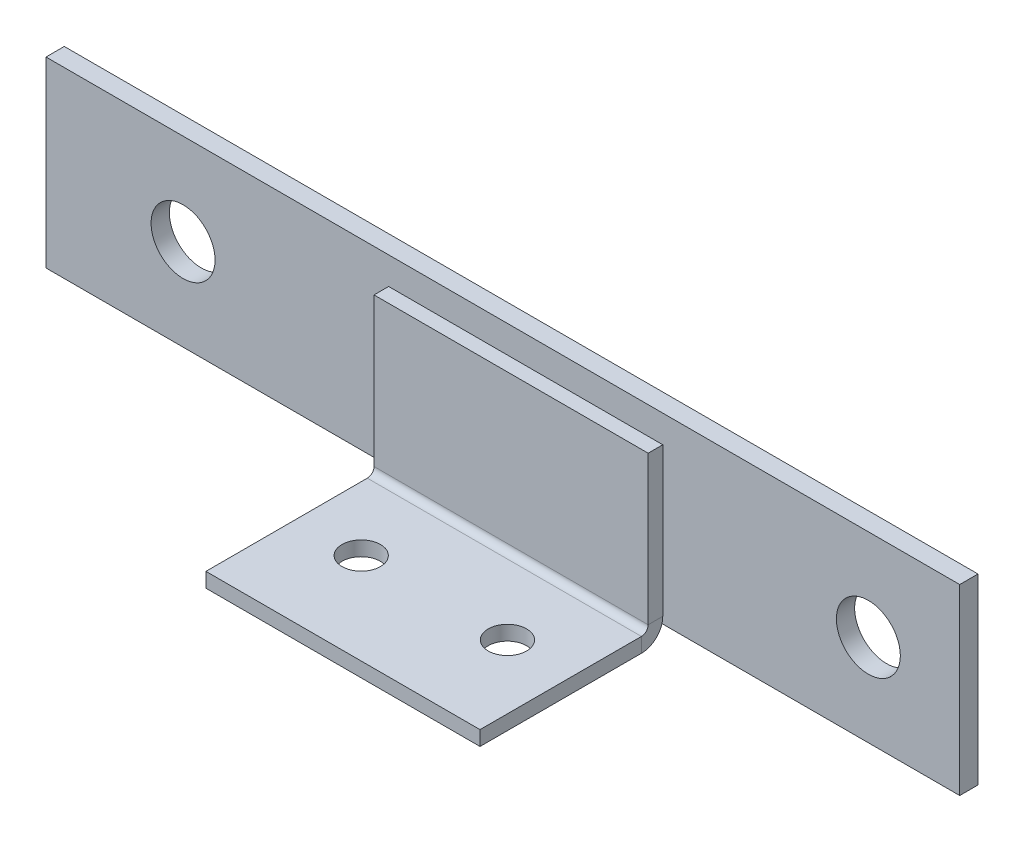
ISO-10303-21;
HEADER;
FILE_DESCRIPTION(('STEP AP214'),'2;1');
FILE_NAME('part.step','',(''),(''),'','','');
FILE_SCHEMA(('AUTOMOTIVE_DESIGN { 1 0 10303 214 1 1 1 1 }'));
ENDSEC;
DATA;
#1=APPLICATION_CONTEXT('core data for automotive mechanical design processes');
#2=APPLICATION_PROTOCOL_DEFINITION('international standard','automotive_design',2000,#1);
#3=PRODUCT_CONTEXT('',#1,'mechanical');
#4=PRODUCT('Part','Part','',(#3));
#5=PRODUCT_RELATED_PRODUCT_CATEGORY('part','',(#4));
#6=PRODUCT_DEFINITION_FORMATION('','',#4);
#7=PRODUCT_DEFINITION_CONTEXT('part definition',#1,'design');
#8=PRODUCT_DEFINITION('design','',#6,#7);
#9=PRODUCT_DEFINITION_SHAPE('','',#8);
#10=(LENGTH_UNIT() NAMED_UNIT(*) SI_UNIT(.MILLI.,.METRE.));
#11=(NAMED_UNIT(*) PLANE_ANGLE_UNIT() SI_UNIT($,.RADIAN.));
#12=(NAMED_UNIT(*) SI_UNIT($,.STERADIAN.) SOLID_ANGLE_UNIT());
#13=UNCERTAINTY_MEASURE_WITH_UNIT(LENGTH_MEASURE(1.E-05),#10,'distance_accuracy_value','');
#14=(GEOMETRIC_REPRESENTATION_CONTEXT(3) GLOBAL_UNCERTAINTY_ASSIGNED_CONTEXT((#13)) GLOBAL_UNIT_ASSIGNED_CONTEXT((#10,
#11,#12)) REPRESENTATION_CONTEXT('',''));
#15=CARTESIAN_POINT('',(0.,0.,0.));
#16=DIRECTION('',(0.,0.,1.));
#17=DIRECTION('',(1.,0.,0.));
#18=AXIS2_PLACEMENT_3D('',#15,#16,#17);
#19=CARTESIAN_POINT('',(-15.,-7.50000000000001,3.6));
#20=DIRECTION('',(1.,0.,0.));
#21=DIRECTION('',(0.,0.,-1.));
#22=AXIS2_PLACEMENT_3D('',#19,#20,#21);
#23=PLANE('',#22);
#24=DIRECTION('',(0.,0.,-1.));
#25=VECTOR('',#24,1.);
#26=CARTESIAN_POINT('',(-15.,-6.76340000000001,3.6));
#27=LINE('',#26,#25);
#28=CARTESIAN_POINT('',(-15.,-6.76340000000001,3.6));
#29=VERTEX_POINT('',#28);
#30=CARTESIAN_POINT('',(-15.,-6.7634,2.));
#31=VERTEX_POINT('',#30);
#32=EDGE_CURVE('E101',#29,#31,#27,.T.);
#33=ORIENTED_EDGE('',*,*,#32,.F.);
#34=DIRECTION('',(0.,-1.,0.));
#35=VECTOR('',#34,1.);
#36=CARTESIAN_POINT('',(-15.,-7.50000000000001,3.6));
#37=LINE('',#36,#35);
#38=CARTESIAN_POINT('',(-15.,9.49999999999999,3.6));
#39=VERTEX_POINT('',#38);
#40=EDGE_CURVE('E91',#39,#29,#37,.T.);
#41=ORIENTED_EDGE('',*,*,#40,.F.);
#42=DIRECTION('',(0.,0.,-1.));
#43=VECTOR('',#42,1.);
#44=CARTESIAN_POINT('',(-15.,9.49999999999999,3.6));
#45=LINE('',#44,#43);
#46=CARTESIAN_POINT('',(-15.,9.49999999999999,2.));
#47=VERTEX_POINT('',#46);
#48=EDGE_CURVE('E55',#39,#47,#45,.T.);
#49=ORIENTED_EDGE('',*,*,#48,.T.);
#50=DIRECTION('',(0.,-1.,0.));
#51=VECTOR('',#50,1.);
#52=CARTESIAN_POINT('',(-15.,-7.50000000000001,2.));
#53=LINE('',#52,#51);
#54=EDGE_CURVE('E97',#47,#31,#53,.T.);
#55=ORIENTED_EDGE('',*,*,#54,.T.);
#56=EDGE_LOOP('',(#33,#41,#49,#55));
#57=FACE_BOUND('',#56,.T.);
#58=ADVANCED_FACE('F48',(#57),#23,.F.);
#59=CARTESIAN_POINT('',(15.,-7.5,3.6));
#60=DIRECTION('',(-1.,0.,0.));
#61=DIRECTION('',(0.,-1.,0.));
#62=AXIS2_PLACEMENT_3D('',#59,#60,#61);
#63=PLANE('',#62);
#64=DIRECTION('',(0.,0.,-1.));
#65=VECTOR('',#64,1.);
#66=CARTESIAN_POINT('',(15.,-6.76340000000001,3.6));
#67=LINE('',#66,#65);
#68=CARTESIAN_POINT('',(15.,-6.76340000000001,3.6));
#69=VERTEX_POINT('',#68);
#70=CARTESIAN_POINT('',(15.,-6.7634,2.));
#71=VERTEX_POINT('',#70);
#72=EDGE_CURVE('E104',#69,#71,#67,.T.);
#73=ORIENTED_EDGE('',*,*,#72,.T.);
#74=DIRECTION('',(0.,1.,0.));
#75=VECTOR('',#74,1.);
#76=CARTESIAN_POINT('',(15.,-7.5,2.));
#77=LINE('',#76,#75);
#78=CARTESIAN_POINT('',(15.,9.5,2.));
#79=VERTEX_POINT('',#78);
#80=EDGE_CURVE('E92',#71,#79,#77,.T.);
#81=ORIENTED_EDGE('',*,*,#80,.T.);
#82=DIRECTION('',(0.,0.,-1.));
#83=VECTOR('',#82,1.);
#84=CARTESIAN_POINT('',(15.,9.5,3.6));
#85=LINE('',#84,#83);
#86=CARTESIAN_POINT('',(15.,9.5,3.6));
#87=VERTEX_POINT('',#86);
#88=EDGE_CURVE('E12',#87,#79,#85,.T.);
#89=ORIENTED_EDGE('',*,*,#88,.F.);
#90=DIRECTION('',(0.,1.,0.));
#91=VECTOR('',#90,1.);
#92=CARTESIAN_POINT('',(15.,-7.5,3.6));
#93=LINE('',#92,#91);
#94=EDGE_CURVE('E108',#69,#87,#93,.T.);
#95=ORIENTED_EDGE('',*,*,#94,.F.);
#96=EDGE_LOOP('',(#73,#81,#89,#95));
#97=FACE_BOUND('',#96,.T.);
#98=ADVANCED_FACE('F234',(#97),#63,.F.);
#99=CARTESIAN_POINT('',(-15.,9.49999999999999,3.6));
#100=DIRECTION('',(0.,0.,-1.));
#101=DIRECTION('',(-1.,0.,0.));
#102=AXIS2_PLACEMENT_3D('',#99,#100,#101);
#103=PLANE('',#102);
#104=DIRECTION('',(1.,0.,0.));
#105=VECTOR('',#104,1.);
#106=CARTESIAN_POINT('',(15.,-6.76340000000001,3.6));
#107=LINE('',#106,#105);
#108=EDGE_CURVE('E116',#69,#29,#107,.F.);
#109=ORIENTED_EDGE('',*,*,#108,.F.);
#110=ORIENTED_EDGE('',*,*,#94,.T.);
#111=DIRECTION('',(-1.,0.,0.));
#112=VECTOR('',#111,1.);
#113=CARTESIAN_POINT('',(-15.,9.49999999999999,3.6));
#114=LINE('',#113,#112);
#115=EDGE_CURVE('E71',#87,#39,#114,.T.);
#116=ORIENTED_EDGE('',*,*,#115,.T.);
#117=ORIENTED_EDGE('',*,*,#40,.T.);
#118=EDGE_LOOP('',(#109,#110,#116,#117));
#119=FACE_BOUND('',#118,.T.);
#120=ADVANCED_FACE('F233',(#119),#103,.F.);
#121=CARTESIAN_POINT('',(-15.,9.49999999999999,2.));
#122=DIRECTION('',(0.,0.,-1.));
#123=DIRECTION('',(-1.,0.,0.));
#124=AXIS2_PLACEMENT_3D('',#121,#122,#123);
#125=PLANE('',#124);
#126=ORIENTED_EDGE('',*,*,#80,.F.);
#127=DIRECTION('',(1.,0.,0.));
#128=VECTOR('',#127,1.);
#129=CARTESIAN_POINT('',(15.,-6.7634,2.));
#130=LINE('',#129,#128);
#131=EDGE_CURVE('E100',#71,#31,#130,.F.);
#132=ORIENTED_EDGE('',*,*,#131,.T.);
#133=ORIENTED_EDGE('',*,*,#54,.F.);
#134=DIRECTION('',(-1.,0.,0.));
#135=VECTOR('',#134,1.);
#136=CARTESIAN_POINT('',(-15.,9.49999999999999,2.));
#137=LINE('',#136,#135);
#138=EDGE_CURVE('E83',#79,#47,#137,.T.);
#139=ORIENTED_EDGE('',*,*,#138,.F.);
#140=EDGE_LOOP('',(#126,#132,#133,#139));
#141=FACE_BOUND('',#140,.T.);
#142=ADVANCED_FACE('F99',(#141),#125,.T.);
#143=CARTESIAN_POINT('',(-15.,9.49999999999999,3.6));
#144=DIRECTION('',(0.,-1.,0.));
#145=DIRECTION('',(1.,0.,0.));
#146=AXIS2_PLACEMENT_3D('',#143,#144,#145);
#147=PLANE('',#146);
#148=ORIENTED_EDGE('',*,*,#138,.T.);
#149=ORIENTED_EDGE('',*,*,#48,.F.);
#150=ORIENTED_EDGE('',*,*,#115,.F.);
#151=ORIENTED_EDGE('',*,*,#88,.T.);
#152=EDGE_LOOP('',(#148,#149,#150,#151));
#153=FACE_BOUND('',#152,.T.);
#154=ADVANCED_FACE('F85',(#153),#147,.F.);
#155=CARTESIAN_POINT('',(-15.,-6.76340000000001,4.3366));
#156=DIRECTION('',(-1.,0.,0.));
#157=DIRECTION('',(0.,0.,1.));
#158=AXIS2_PLACEMENT_3D('',#155,#156,#157);
#159=PLANE('',#158);
#160=DIRECTION('',(0.,-1.,0.));
#161=VECTOR('',#160,1.);
#162=CARTESIAN_POINT('',(-15.,-7.50000000000001,4.3366));
#163=LINE('',#162,#161);
#164=CARTESIAN_POINT('',(-15.,-7.50000000000001,4.3366));
#165=VERTEX_POINT('',#164);
#166=CARTESIAN_POINT('',(-15.,-9.10000000000001,4.33659999999999));
#167=VERTEX_POINT('',#166);
#168=EDGE_CURVE('E154',#165,#167,#163,.T.);
#169=ORIENTED_EDGE('',*,*,#168,.F.);
#170=CARTESIAN_POINT('',(-15.,-6.76340000000001,4.3366));
#171=DIRECTION('',(1.,0.,0.));
#172=DIRECTION('',(0.,0.,-1.));
#173=AXIS2_PLACEMENT_3D('',#170,#171,#172);
#174=CIRCLE('',#173,0.736600000000001);
#175=EDGE_CURVE('E120',#29,#165,#174,.F.);
#176=ORIENTED_EDGE('',*,*,#175,.F.);
#177=ORIENTED_EDGE('',*,*,#32,.T.);
#178=CARTESIAN_POINT('',(-15.,-6.76340000000001,4.3366));
#179=DIRECTION('',(1.,0.,0.));
#180=DIRECTION('',(0.,0.,-1.));
#181=AXIS2_PLACEMENT_3D('',#178,#179,#180);
#182=CIRCLE('',#181,2.3366);
#183=EDGE_CURVE('E62',#31,#167,#182,.F.);
#184=ORIENTED_EDGE('',*,*,#183,.T.);
#185=EDGE_LOOP('',(#169,#176,#177,#184));
#186=FACE_BOUND('',#185,.T.);
#187=ADVANCED_FACE('F244',(#186),#159,.T.);
#188=CARTESIAN_POINT('',(15.,-6.76340000000001,4.3366));
#189=DIRECTION('',(-1.,0.,0.));
#190=DIRECTION('',(0.,0.,1.));
#191=AXIS2_PLACEMENT_3D('',#188,#189,#190);
#192=PLANE('',#191);
#193=CARTESIAN_POINT('',(15.,-6.76340000000001,4.3366));
#194=DIRECTION('',(1.,0.,0.));
#195=DIRECTION('',(0.,0.,-1.));
#196=AXIS2_PLACEMENT_3D('',#193,#194,#195);
#197=CIRCLE('',#196,0.736600000000001);
#198=CARTESIAN_POINT('',(15.,-7.50000000000001,4.3366));
#199=VERTEX_POINT('',#198);
#200=EDGE_CURVE('E113',#199,#69,#197,.T.);
#201=ORIENTED_EDGE('',*,*,#200,.F.);
#202=DIRECTION('',(0.,-1.,0.));
#203=VECTOR('',#202,1.);
#204=CARTESIAN_POINT('',(15.,-7.50000000000001,4.3366));
#205=LINE('',#204,#203);
#206=CARTESIAN_POINT('',(15.,-9.10000000000001,4.33659999999999));
#207=VERTEX_POINT('',#206);
#208=EDGE_CURVE('E153',#199,#207,#205,.T.);
#209=ORIENTED_EDGE('',*,*,#208,.T.);
#210=CARTESIAN_POINT('',(15.,-6.76340000000001,4.3366));
#211=DIRECTION('',(1.,0.,0.));
#212=DIRECTION('',(0.,0.,-1.));
#213=AXIS2_PLACEMENT_3D('',#210,#211,#212);
#214=CIRCLE('',#213,2.3366);
#215=EDGE_CURVE('E123',#207,#71,#214,.T.);
#216=ORIENTED_EDGE('',*,*,#215,.T.);
#217=ORIENTED_EDGE('',*,*,#72,.F.);
#218=EDGE_LOOP('',(#201,#209,#216,#217));
#219=FACE_BOUND('',#218,.T.);
#220=ADVANCED_FACE('F225',(#219),#192,.F.);
#221=CARTESIAN_POINT('',(15.,-6.76340000000001,4.3366));
#222=DIRECTION('',(1.,0.,0.));
#223=DIRECTION('',(0.,-1.,0.));
#224=AXIS2_PLACEMENT_3D('',#221,#222,#223);
#225=CYLINDRICAL_SURFACE('',#224,2.3366);
#226=ORIENTED_EDGE('',*,*,#131,.F.);
#227=ORIENTED_EDGE('',*,*,#215,.F.);
#228=DIRECTION('',(-1.,0.,0.));
#229=VECTOR('',#228,1.);
#230=CARTESIAN_POINT('',(15.,-9.1,4.33659999999999));
#231=LINE('',#230,#229);
#232=EDGE_CURVE('E144',#207,#167,#231,.T.);
#233=ORIENTED_EDGE('',*,*,#232,.T.);
#234=ORIENTED_EDGE('',*,*,#183,.F.);
#235=EDGE_LOOP('',(#226,#227,#233,#234));
#236=FACE_BOUND('',#235,.T.);
#237=ADVANCED_FACE('F249',(#236),#225,.T.);
#238=CARTESIAN_POINT('',(15.,-6.76340000000001,4.3366));
#239=DIRECTION('',(1.,0.,0.));
#240=DIRECTION('',(0.,-1.,0.));
#241=AXIS2_PLACEMENT_3D('',#238,#239,#240);
#242=CYLINDRICAL_SURFACE('',#241,0.736600000000001);
#243=ORIENTED_EDGE('',*,*,#108,.T.);
#244=ORIENTED_EDGE('',*,*,#175,.T.);
#245=DIRECTION('',(1.,0.,0.));
#246=VECTOR('',#245,1.);
#247=CARTESIAN_POINT('',(-15.,-7.50000000000001,4.3366));
#248=LINE('',#247,#246);
#249=EDGE_CURVE('E157',#165,#199,#248,.T.);
#250=ORIENTED_EDGE('',*,*,#249,.T.);
#251=ORIENTED_EDGE('',*,*,#200,.T.);
#252=EDGE_LOOP('',(#243,#244,#250,#251));
#253=FACE_BOUND('',#252,.T.);
#254=ADVANCED_FACE('F231',(#253),#242,.F.);
#255=CARTESIAN_POINT('',(15.,-9.10000000000007,22.));
#256=DIRECTION('',(-1.,0.,0.));
#257=DIRECTION('',(0.,-1.,0.));
#258=AXIS2_PLACEMENT_3D('',#255,#256,#257);
#259=PLANE('',#258);
#260=ORIENTED_EDGE('',*,*,#208,.F.);
#261=DIRECTION('',(0.,0.,1.));
#262=VECTOR('',#261,1.);
#263=CARTESIAN_POINT('',(15.,-7.50000000000007,22.));
#264=LINE('',#263,#262);
#265=CARTESIAN_POINT('',(15.,-7.50000000000007,22.));
#266=VERTEX_POINT('',#265);
#267=EDGE_CURVE('E141',#199,#266,#264,.T.);
#268=ORIENTED_EDGE('',*,*,#267,.T.);
#269=DIRECTION('',(0.,1.,0.));
#270=VECTOR('',#269,1.);
#271=CARTESIAN_POINT('',(15.,-9.10000000000007,22.));
#272=LINE('',#271,#270);
#273=CARTESIAN_POINT('',(15.,-9.10000000000007,22.));
#274=VERTEX_POINT('',#273);
#275=EDGE_CURVE('E117',#274,#266,#272,.T.);
#276=ORIENTED_EDGE('',*,*,#275,.F.);
#277=DIRECTION('',(0.,0.,1.));
#278=VECTOR('',#277,1.);
#279=CARTESIAN_POINT('',(15.,-9.10000000000007,22.));
#280=LINE('',#279,#278);
#281=EDGE_CURVE('E137',#207,#274,#280,.T.);
#282=ORIENTED_EDGE('',*,*,#281,.F.);
#283=EDGE_LOOP('',(#260,#268,#276,#282));
#284=FACE_BOUND('',#283,.T.);
#285=ADVANCED_FACE('F197',(#284),#259,.F.);
#286=CARTESIAN_POINT('',(-15.,-9.10000000000001,3.59999999999999));
#287=DIRECTION('',(1.,0.,0.));
#288=DIRECTION('',(0.,1.,0.));
#289=AXIS2_PLACEMENT_3D('',#286,#287,#288);
#290=PLANE('',#289);
#291=ORIENTED_EDGE('',*,*,#168,.T.);
#292=DIRECTION('',(0.,0.,-1.));
#293=VECTOR('',#292,1.);
#294=CARTESIAN_POINT('',(-15.,-9.10000000000001,3.59999999999999));
#295=LINE('',#294,#293);
#296=CARTESIAN_POINT('',(-15.,-9.10000000000007,22.));
#297=VERTEX_POINT('',#296);
#298=EDGE_CURVE('E133',#297,#167,#295,.T.);
#299=ORIENTED_EDGE('',*,*,#298,.F.);
#300=DIRECTION('',(0.,1.,0.));
#301=VECTOR('',#300,1.);
#302=CARTESIAN_POINT('',(-15.,-9.10000000000007,22.));
#303=LINE('',#302,#301);
#304=CARTESIAN_POINT('',(-15.,-7.50000000000007,22.));
#305=VERTEX_POINT('',#304);
#306=EDGE_CURVE('E130',#297,#305,#303,.T.);
#307=ORIENTED_EDGE('',*,*,#306,.T.);
#308=DIRECTION('',(0.,0.,-1.));
#309=VECTOR('',#308,1.);
#310=CARTESIAN_POINT('',(-15.,-7.50000000000001,3.6));
#311=LINE('',#310,#309);
#312=EDGE_CURVE('E134',#305,#165,#311,.T.);
#313=ORIENTED_EDGE('',*,*,#312,.T.);
#314=EDGE_LOOP('',(#291,#299,#307,#313));
#315=FACE_BOUND('',#314,.T.);
#316=ADVANCED_FACE('F259',(#315),#290,.F.);
#317=CARTESIAN_POINT('',(15.,-9.1,3.59999999999999));
#318=DIRECTION('',(0.,1.,0.));
#319=DIRECTION('',(0.,0.,1.));
#320=AXIS2_PLACEMENT_3D('',#317,#318,#319);
#321=PLANE('',#320);
#322=CARTESIAN_POINT('',(8.,-9.10000000000003,12.));
#323=DIRECTION('',(0.,1.,0.));
#324=DIRECTION('',(0.,0.,1.));
#325=AXIS2_PLACEMENT_3D('',#322,#323,#324);
#326=CIRCLE('',#325,2.1);
#327=CARTESIAN_POINT('',(8.,-9.10000000000004,14.1));
#328=VERTEX_POINT('',#327);
#329=EDGE_CURVE('E168',#328,#328,#326,.T.);
#330=ORIENTED_EDGE('',*,*,#329,.T.);
#331=EDGE_LOOP('',(#330));
#332=FACE_BOUND('',#331,.T.);
#333=CARTESIAN_POINT('',(-8.,-9.10000000000004,12.));
#334=DIRECTION('',(0.,1.,0.));
#335=DIRECTION('',(0.,0.,1.));
#336=AXIS2_PLACEMENT_3D('',#333,#334,#335);
#337=CIRCLE('',#336,2.1);
#338=CARTESIAN_POINT('',(-8.,-9.10000000000004,14.1));
#339=VERTEX_POINT('',#338);
#340=EDGE_CURVE('E158',#339,#339,#337,.T.);
#341=ORIENTED_EDGE('',*,*,#340,.T.);
#342=EDGE_LOOP('',(#341));
#343=FACE_BOUND('',#342,.T.);
#344=ORIENTED_EDGE('',*,*,#232,.F.);
#345=ORIENTED_EDGE('',*,*,#281,.T.);
#346=DIRECTION('',(-1.,0.,0.));
#347=VECTOR('',#346,1.);
#348=CARTESIAN_POINT('',(-15.,-9.10000000000007,22.));
#349=LINE('',#348,#347);
#350=EDGE_CURVE('E147',#274,#297,#349,.T.);
#351=ORIENTED_EDGE('',*,*,#350,.T.);
#352=ORIENTED_EDGE('',*,*,#298,.T.);
#353=EDGE_LOOP('',(#344,#345,#351,#352));
#354=FACE_BOUND('',#353,.T.);
#355=ADVANCED_FACE('F182',(#332,#343,#354),#321,.F.);
#356=CARTESIAN_POINT('',(15.,-7.5,3.6));
#357=DIRECTION('',(0.,1.,0.));
#358=DIRECTION('',(0.,0.,1.));
#359=AXIS2_PLACEMENT_3D('',#356,#357,#358);
#360=PLANE('',#359);
#361=CARTESIAN_POINT('',(8.,-7.50000000000003,12.));
#362=DIRECTION('',(0.,1.,0.));
#363=DIRECTION('',(0.,0.,1.));
#364=AXIS2_PLACEMENT_3D('',#361,#362,#363);
#365=CIRCLE('',#364,2.1);
#366=CARTESIAN_POINT('',(8.,-7.50000000000004,14.1));
#367=VERTEX_POINT('',#366);
#368=EDGE_CURVE('E171',#367,#367,#365,.T.);
#369=ORIENTED_EDGE('',*,*,#368,.F.);
#370=EDGE_LOOP('',(#369));
#371=FACE_BOUND('',#370,.T.);
#372=CARTESIAN_POINT('',(-8.,-7.50000000000004,12.));
#373=DIRECTION('',(0.,1.,0.));
#374=DIRECTION('',(0.,0.,1.));
#375=AXIS2_PLACEMENT_3D('',#372,#373,#374);
#376=CIRCLE('',#375,2.1);
#377=CARTESIAN_POINT('',(-8.,-7.50000000000004,14.1));
#378=VERTEX_POINT('',#377);
#379=EDGE_CURVE('E165',#378,#378,#376,.T.);
#380=ORIENTED_EDGE('',*,*,#379,.F.);
#381=EDGE_LOOP('',(#380));
#382=FACE_BOUND('',#381,.T.);
#383=ORIENTED_EDGE('',*,*,#267,.F.);
#384=ORIENTED_EDGE('',*,*,#249,.F.);
#385=ORIENTED_EDGE('',*,*,#312,.F.);
#386=DIRECTION('',(-1.,0.,0.));
#387=VECTOR('',#386,1.);
#388=CARTESIAN_POINT('',(-15.,-7.50000000000007,22.));
#389=LINE('',#388,#387);
#390=EDGE_CURVE('E138',#266,#305,#389,.T.);
#391=ORIENTED_EDGE('',*,*,#390,.F.);
#392=EDGE_LOOP('',(#383,#384,#385,#391));
#393=FACE_BOUND('',#392,.T.);
#394=ADVANCED_FACE('F178',(#371,#382,#393),#360,.T.);
#395=CARTESIAN_POINT('',(-15.,-9.10000000000007,22.));
#396=DIRECTION('',(0.,0.,-1.));
#397=DIRECTION('',(0.,1.,0.));
#398=AXIS2_PLACEMENT_3D('',#395,#396,#397);
#399=PLANE('',#398);
#400=ORIENTED_EDGE('',*,*,#390,.T.);
#401=ORIENTED_EDGE('',*,*,#306,.F.);
#402=ORIENTED_EDGE('',*,*,#350,.F.);
#403=ORIENTED_EDGE('',*,*,#275,.T.);
#404=EDGE_LOOP('',(#400,#401,#402,#403));
#405=FACE_BOUND('',#404,.T.);
#406=ADVANCED_FACE('F181',(#405),#399,.F.);
#407=CARTESIAN_POINT('',(-8.,-17.5,12.));
#408=DIRECTION('',(0.,1.,0.));
#409=DIRECTION('',(0.,0.,1.));
#410=AXIS2_PLACEMENT_3D('',#407,#408,#409);
#411=CYLINDRICAL_SURFACE('',#410,2.1);
#412=ORIENTED_EDGE('',*,*,#379,.T.);
#413=EDGE_LOOP('',(#412));
#414=FACE_BOUND('',#413,.T.);
#415=ORIENTED_EDGE('',*,*,#340,.F.);
#416=EDGE_LOOP('',(#415));
#417=FACE_BOUND('',#416,.T.);
#418=ADVANCED_FACE('F262',(#414,#417),#411,.F.);
#419=CARTESIAN_POINT('',(8.,-17.5,12.));
#420=DIRECTION('',(0.,1.,0.));
#421=DIRECTION('',(0.,0.,1.));
#422=AXIS2_PLACEMENT_3D('',#419,#420,#421);
#423=CYLINDRICAL_SURFACE('',#422,2.1);
#424=ORIENTED_EDGE('',*,*,#368,.T.);
#425=EDGE_LOOP('',(#424));
#426=FACE_BOUND('',#425,.T.);
#427=ORIENTED_EDGE('',*,*,#329,.F.);
#428=EDGE_LOOP('',(#427));
#429=FACE_BOUND('',#428,.T.);
#430=ADVANCED_FACE('F175',(#426,#429),#423,.F.);
#431=CLOSED_SHELL('',(#58,#98,#120,#142,#154,#187,#220,#237,#254,#285,#316,#355,#394,#406,#418,#430));
#432=MANIFOLD_SOLID_BREP('B2',#431);
#433=CARTESIAN_POINT('',(-52.5,-7.50000000000001,2.));
#434=DIRECTION('',(1.,0.,0.));
#435=DIRECTION('',(0.,0.,-1.));
#436=AXIS2_PLACEMENT_3D('',#433,#434,#435);
#437=PLANE('',#436);
#438=DIRECTION('',(0.,-1.,0.));
#439=VECTOR('',#438,1.);
#440=CARTESIAN_POINT('',(-52.5,-7.50000000000001,0.));
#441=LINE('',#440,#439);
#442=CARTESIAN_POINT('',(-52.5,12.5,0.));
#443=VERTEX_POINT('',#442);
#444=CARTESIAN_POINT('',(-52.5,-7.50000000000001,0.));
#445=VERTEX_POINT('',#444);
#446=EDGE_CURVE('E464',#443,#445,#441,.T.);
#447=ORIENTED_EDGE('',*,*,#446,.T.);
#448=DIRECTION('',(0.,0.,-1.));
#449=VECTOR('',#448,1.);
#450=CARTESIAN_POINT('',(-52.5,-7.50000000000001,2.));
#451=LINE('',#450,#449);
#452=CARTESIAN_POINT('',(-52.5,-7.50000000000001,2.));
#453=VERTEX_POINT('',#452);
#454=EDGE_CURVE('E46',#453,#445,#451,.T.);
#455=ORIENTED_EDGE('',*,*,#454,.F.);
#456=DIRECTION('',(0.,-1.,0.));
#457=VECTOR('',#456,1.);
#458=CARTESIAN_POINT('',(-52.5,-7.50000000000001,2.));
#459=LINE('',#458,#457);
#460=CARTESIAN_POINT('',(-52.5,12.5,2.));
#461=VERTEX_POINT('',#460);
#462=EDGE_CURVE('E452',#461,#453,#459,.T.);
#463=ORIENTED_EDGE('',*,*,#462,.F.);
#464=DIRECTION('',(0.,0.,-1.));
#465=VECTOR('',#464,1.);
#466=CARTESIAN_POINT('',(-52.5,12.5,2.));
#467=LINE('',#466,#465);
#468=EDGE_CURVE('E460',#461,#443,#467,.T.);
#469=ORIENTED_EDGE('',*,*,#468,.T.);
#470=EDGE_LOOP('',(#447,#455,#463,#469));
#471=FACE_BOUND('',#470,.T.);
#472=ADVANCED_FACE('F401',(#471),#437,.F.);
#473=CARTESIAN_POINT('',(47.5,-7.49999999999999,2.));
#474=DIRECTION('',(0.,1.,0.));
#475=DIRECTION('',(-1.,0.,0.));
#476=AXIS2_PLACEMENT_3D('',#473,#474,#475);
#477=PLANE('',#476);
#478=DIRECTION('',(1.,0.,0.));
#479=VECTOR('',#478,1.);
#480=CARTESIAN_POINT('',(47.5,-7.49999999999999,0.));
#481=LINE('',#480,#479);
#482=CARTESIAN_POINT('',(47.5,-7.49999999999999,0.));
#483=VERTEX_POINT('',#482);
#484=EDGE_CURVE('E456',#445,#483,#481,.T.);
#485=ORIENTED_EDGE('',*,*,#484,.T.);
#486=DIRECTION('',(0.,0.,-1.));
#487=VECTOR('',#486,1.);
#488=CARTESIAN_POINT('',(47.5,-7.49999999999999,2.));
#489=LINE('',#488,#487);
#490=CARTESIAN_POINT('',(47.5,-7.49999999999999,2.));
#491=VERTEX_POINT('',#490);
#492=EDGE_CURVE('E409',#491,#483,#489,.T.);
#493=ORIENTED_EDGE('',*,*,#492,.F.);
#494=DIRECTION('',(1.,0.,0.));
#495=VECTOR('',#494,1.);
#496=CARTESIAN_POINT('',(47.5,-7.49999999999999,2.));
#497=LINE('',#496,#495);
#498=EDGE_CURVE('E447',#453,#491,#497,.T.);
#499=ORIENTED_EDGE('',*,*,#498,.F.);
#500=ORIENTED_EDGE('',*,*,#454,.T.);
#501=EDGE_LOOP('',(#485,#493,#499,#500));
#502=FACE_BOUND('',#501,.T.);
#503=ADVANCED_FACE('F455',(#502),#477,.F.);
#504=CARTESIAN_POINT('',(47.5,-7.49999999999999,2.));
#505=DIRECTION('',(-1.,0.,0.));
#506=DIRECTION('',(0.,0.,1.));
#507=AXIS2_PLACEMENT_3D('',#504,#505,#506);
#508=PLANE('',#507);
#509=DIRECTION('',(0.,1.,0.));
#510=VECTOR('',#509,1.);
#511=CARTESIAN_POINT('',(47.5,-7.49999999999999,0.));
#512=LINE('',#511,#510);
#513=CARTESIAN_POINT('',(47.5,12.5,0.));
#514=VERTEX_POINT('',#513);
#515=EDGE_CURVE('E434',#483,#514,#512,.T.);
#516=ORIENTED_EDGE('',*,*,#515,.T.);
#517=DIRECTION('',(0.,0.,-1.));
#518=VECTOR('',#517,1.);
#519=CARTESIAN_POINT('',(47.5,12.5,2.));
#520=LINE('',#519,#518);
#521=CARTESIAN_POINT('',(47.5,12.5,2.));
#522=VERTEX_POINT('',#521);
#523=EDGE_CURVE('E457',#522,#514,#520,.T.);
#524=ORIENTED_EDGE('',*,*,#523,.F.);
#525=DIRECTION('',(0.,1.,0.));
#526=VECTOR('',#525,1.);
#527=CARTESIAN_POINT('',(47.5,-7.49999999999999,2.));
#528=LINE('',#527,#526);
#529=EDGE_CURVE('E450',#491,#522,#528,.T.);
#530=ORIENTED_EDGE('',*,*,#529,.F.);
#531=ORIENTED_EDGE('',*,*,#492,.T.);
#532=EDGE_LOOP('',(#516,#524,#530,#531));
#533=FACE_BOUND('',#532,.T.);
#534=ADVANCED_FACE('F458',(#533),#508,.F.);
#535=CARTESIAN_POINT('',(47.5,12.5,2.));
#536=DIRECTION('',(0.,-1.,0.));
#537=DIRECTION('',(1.,0.,0.));
#538=AXIS2_PLACEMENT_3D('',#535,#536,#537);
#539=PLANE('',#538);
#540=DIRECTION('',(-1.,0.,0.));
#541=VECTOR('',#540,1.);
#542=CARTESIAN_POINT('',(47.5,12.5,0.));
#543=LINE('',#542,#541);
#544=EDGE_CURVE('E440',#514,#443,#543,.T.);
#545=ORIENTED_EDGE('',*,*,#544,.T.);
#546=ORIENTED_EDGE('',*,*,#468,.F.);
#547=DIRECTION('',(-1.,0.,0.));
#548=VECTOR('',#547,1.);
#549=CARTESIAN_POINT('',(47.5,12.5,2.));
#550=LINE('',#549,#548);
#551=EDGE_CURVE('E417',#522,#461,#550,.T.);
#552=ORIENTED_EDGE('',*,*,#551,.F.);
#553=ORIENTED_EDGE('',*,*,#523,.T.);
#554=EDGE_LOOP('',(#545,#546,#552,#553));
#555=FACE_BOUND('',#554,.T.);
#556=ADVANCED_FACE('F472',(#555),#539,.F.);
#557=CARTESIAN_POINT('',(-52.5,12.5,2.));
#558=DIRECTION('',(0.,0.,1.));
#559=DIRECTION('',(1.,0.,0.));
#560=AXIS2_PLACEMENT_3D('',#557,#558,#559);
#561=PLANE('',#560);
#562=CARTESIAN_POINT('',(37.5,2.50000000000001,2.));
#563=DIRECTION('',(0.,0.,1.));
#564=DIRECTION('',(1.,0.,0.));
#565=AXIS2_PLACEMENT_3D('',#562,#563,#564);
#566=CIRCLE('',#565,3.5);
#567=CARTESIAN_POINT('',(41.,2.50000000000001,2.));
#568=VERTEX_POINT('',#567);
#569=EDGE_CURVE('E484',#568,#568,#566,.T.);
#570=ORIENTED_EDGE('',*,*,#569,.F.);
#571=EDGE_LOOP('',(#570));
#572=FACE_BOUND('',#571,.T.);
#573=CARTESIAN_POINT('',(-37.5,2.50000000000001,2.));
#574=DIRECTION('',(0.,0.,1.));
#575=DIRECTION('',(1.,0.,0.));
#576=AXIS2_PLACEMENT_3D('',#573,#574,#575);
#577=CIRCLE('',#576,3.5);
#578=CARTESIAN_POINT('',(-34.,2.50000000000001,2.));
#579=VERTEX_POINT('',#578);
#580=EDGE_CURVE('E478',#579,#579,#577,.T.);
#581=ORIENTED_EDGE('',*,*,#580,.F.);
#582=EDGE_LOOP('',(#581));
#583=FACE_BOUND('',#582,.T.);
#584=ORIENTED_EDGE('',*,*,#462,.T.);
#585=ORIENTED_EDGE('',*,*,#498,.T.);
#586=ORIENTED_EDGE('',*,*,#529,.T.);
#587=ORIENTED_EDGE('',*,*,#551,.T.);
#588=EDGE_LOOP('',(#584,#585,#586,#587));
#589=FACE_BOUND('',#588,.T.);
#590=ADVANCED_FACE('F448',(#572,#583,#589),#561,.T.);
#591=CARTESIAN_POINT('',(-52.5,12.5,0.));
#592=DIRECTION('',(0.,0.,1.));
#593=DIRECTION('',(1.,0.,0.));
#594=AXIS2_PLACEMENT_3D('',#591,#592,#593);
#595=PLANE('',#594);
#596=CARTESIAN_POINT('',(37.5,2.50000000000001,0.));
#597=DIRECTION('',(0.,0.,1.));
#598=DIRECTION('',(1.,0.,0.));
#599=AXIS2_PLACEMENT_3D('',#596,#597,#598);
#600=CIRCLE('',#599,3.5);
#601=CARTESIAN_POINT('',(41.,2.50000000000001,0.));
#602=VERTEX_POINT('',#601);
#603=EDGE_CURVE('E481',#602,#602,#600,.T.);
#604=ORIENTED_EDGE('',*,*,#603,.T.);
#605=EDGE_LOOP('',(#604));
#606=FACE_BOUND('',#605,.T.);
#607=CARTESIAN_POINT('',(-37.5,2.50000000000001,0.));
#608=DIRECTION('',(0.,0.,1.));
#609=DIRECTION('',(1.,0.,0.));
#610=AXIS2_PLACEMENT_3D('',#607,#608,#609);
#611=CIRCLE('',#610,3.5);
#612=CARTESIAN_POINT('',(-34.,2.50000000000001,0.));
#613=VERTEX_POINT('',#612);
#614=EDGE_CURVE('E467',#613,#613,#611,.T.);
#615=ORIENTED_EDGE('',*,*,#614,.T.);
#616=EDGE_LOOP('',(#615));
#617=FACE_BOUND('',#616,.T.);
#618=ORIENTED_EDGE('',*,*,#446,.F.);
#619=ORIENTED_EDGE('',*,*,#544,.F.);
#620=ORIENTED_EDGE('',*,*,#515,.F.);
#621=ORIENTED_EDGE('',*,*,#484,.F.);
#622=EDGE_LOOP('',(#618,#619,#620,#621));
#623=FACE_BOUND('',#622,.T.);
#624=ADVANCED_FACE('F475',(#606,#617,#623),#595,.F.);
#625=CARTESIAN_POINT('',(-37.5,2.50000000000001,0.));
#626=DIRECTION('',(0.,0.,1.));
#627=DIRECTION('',(1.,0.,0.));
#628=AXIS2_PLACEMENT_3D('',#625,#626,#627);
#629=CYLINDRICAL_SURFACE('',#628,3.5);
#630=ORIENTED_EDGE('',*,*,#614,.F.);
#631=EDGE_LOOP('',(#630));
#632=FACE_BOUND('',#631,.T.);
#633=ORIENTED_EDGE('',*,*,#580,.T.);
#634=EDGE_LOOP('',(#633));
#635=FACE_BOUND('',#634,.T.);
#636=ADVANCED_FACE('F495',(#632,#635),#629,.F.);
#637=CARTESIAN_POINT('',(37.5,2.50000000000001,0.));
#638=DIRECTION('',(0.,0.,1.));
#639=DIRECTION('',(1.,0.,0.));
#640=AXIS2_PLACEMENT_3D('',#637,#638,#639);
#641=CYLINDRICAL_SURFACE('',#640,3.5);
#642=ORIENTED_EDGE('',*,*,#603,.F.);
#643=EDGE_LOOP('',(#642));
#644=FACE_BOUND('',#643,.T.);
#645=ORIENTED_EDGE('',*,*,#569,.T.);
#646=EDGE_LOOP('',(#645));
#647=FACE_BOUND('',#646,.T.);
#648=ADVANCED_FACE('F492',(#644,#647),#641,.F.);
#649=CLOSED_SHELL('',(#472,#503,#534,#556,#590,#624,#636,#648));
#650=MANIFOLD_SOLID_BREP('B6',#649);
#651=ADVANCED_BREP_SHAPE_REPRESENTATION('',(#18,#432,#650),#14);
#652=SHAPE_DEFINITION_REPRESENTATION(#9,#651);
ENDSEC;
END-ISO-10303-21;
